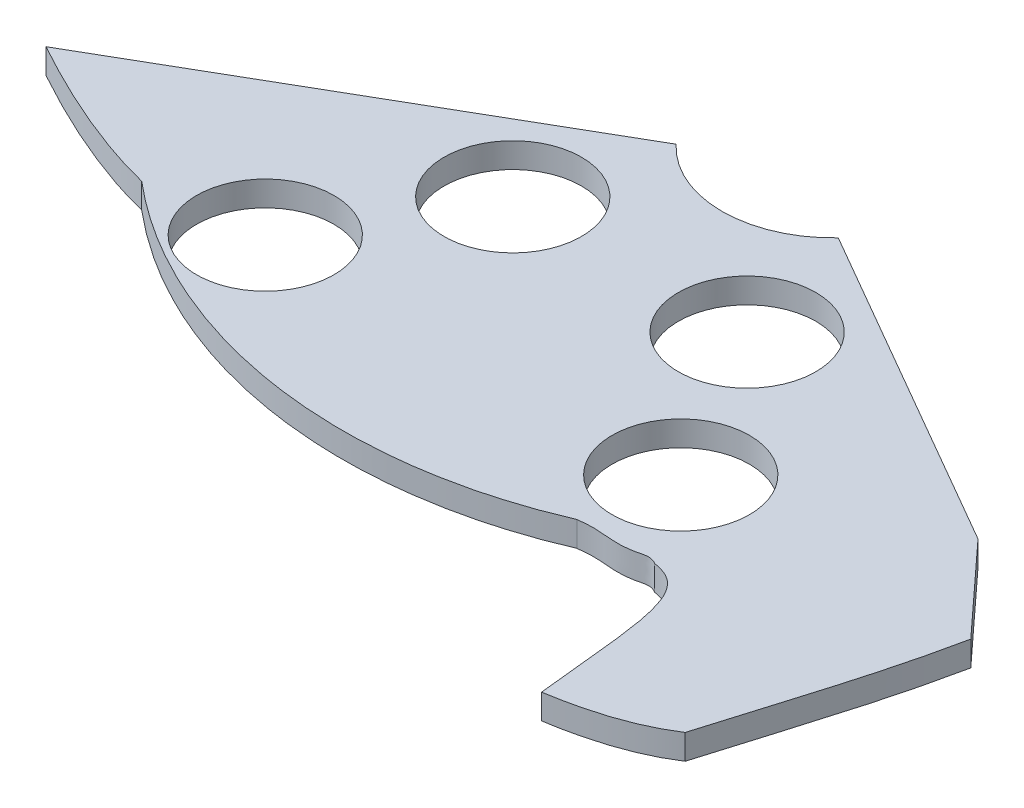
ISO-10303-21;
HEADER;
FILE_DESCRIPTION(('STEP AP214'),'2;1');
FILE_NAME('part.step','',(''),(''),'','','');
FILE_SCHEMA(('AUTOMOTIVE_DESIGN { 1 0 10303 214 1 1 1 1 }'));
ENDSEC;
DATA;
#1=APPLICATION_CONTEXT('core data for automotive mechanical design processes');
#2=APPLICATION_PROTOCOL_DEFINITION('international standard','automotive_design',2000,#1);
#3=PRODUCT_CONTEXT('',#1,'mechanical');
#4=PRODUCT('Part','Part','',(#3));
#5=PRODUCT_RELATED_PRODUCT_CATEGORY('part','',(#4));
#6=PRODUCT_DEFINITION_FORMATION('','',#4);
#7=PRODUCT_DEFINITION_CONTEXT('part definition',#1,'design');
#8=PRODUCT_DEFINITION('design','',#6,#7);
#9=PRODUCT_DEFINITION_SHAPE('','',#8);
#10=(LENGTH_UNIT() NAMED_UNIT(*) SI_UNIT(.MILLI.,.METRE.));
#11=(NAMED_UNIT(*) PLANE_ANGLE_UNIT() SI_UNIT($,.RADIAN.));
#12=(NAMED_UNIT(*) SI_UNIT($,.STERADIAN.) SOLID_ANGLE_UNIT());
#13=UNCERTAINTY_MEASURE_WITH_UNIT(LENGTH_MEASURE(1.E-05),#10,'distance_accuracy_value','');
#14=(GEOMETRIC_REPRESENTATION_CONTEXT(3) GLOBAL_UNCERTAINTY_ASSIGNED_CONTEXT((#13)) GLOBAL_UNIT_ASSIGNED_CONTEXT((#10,
#11,#12)) REPRESENTATION_CONTEXT('',''));
#15=CARTESIAN_POINT('',(0.,0.,0.));
#16=DIRECTION('',(0.,0.,1.));
#17=DIRECTION('',(1.,0.,0.));
#18=AXIS2_PLACEMENT_3D('',#15,#16,#17);
#19=CARTESIAN_POINT('',(-64.1008296728101,-39.7359999999999,55.3526339606867));
#20=DIRECTION('',(0.,1.,0.));
#21=DIRECTION('',(0.,0.,1.));
#22=AXIS2_PLACEMENT_3D('',#19,#20,#21);
#23=PLANE('',#22);
#24=CARTESIAN_POINT('',(18.75,-39.7359999999999,32.476));
#25=DIRECTION('',(0.,-1.,0.));
#26=DIRECTION('',(0.,0.,-1.));
#27=AXIS2_PLACEMENT_3D('',#24,#25,#26);
#28=CIRCLE('',#27,10.999845998306);
#29=CARTESIAN_POINT('',(18.75,-39.7359999999999,21.476154001694));
#30=VERTEX_POINT('',#29);
#31=EDGE_CURVE('E513',#30,#30,#28,.T.);
#32=ORIENTED_EDGE('',*,*,#31,.F.);
#33=EDGE_LOOP('',(#32));
#34=FACE_BOUND('',#33,.T.);
#35=CARTESIAN_POINT('',(-33.25,-39.7359999999999,57.591));
#36=DIRECTION('',(0.,-1.,0.));
#37=DIRECTION('',(0.,0.,-1.));
#38=AXIS2_PLACEMENT_3D('',#35,#36,#37);
#39=CIRCLE('',#38,10.999845998306);
#40=CARTESIAN_POINT('',(-33.25,-39.7359999999999,46.591154001694));
#41=VERTEX_POINT('',#40);
#42=EDGE_CURVE('E444',#41,#41,#39,.T.);
#43=ORIENTED_EDGE('',*,*,#42,.F.);
#44=EDGE_LOOP('',(#43));
#45=FACE_BOUND('',#44,.T.);
#46=DIRECTION('',(0.866024373768481,0.,-0.500001784035727));
#47=VECTOR('',#46,1.);
#48=CARTESIAN_POINT('',(-69.4473149774022,-39.7359999999999,44.7142826012584));
#49=LINE('',#48,#47);
#50=CARTESIAN_POINT('',(-76.9089394758876,-39.7359999999999,49.0222740089515));
#51=VERTEX_POINT('',#50);
#52=CARTESIAN_POINT('',(-69.4473149774022,-39.7359999999999,44.7142826012584));
#53=VERTEX_POINT('',#52);
#54=EDGE_CURVE('E414',#51,#53,#49,.T.);
#55=ORIENTED_EDGE('',*,*,#54,.T.);
#56=DIRECTION('',(0.866025119197463,0.,-0.500000492918778));
#57=VECTOR('',#56,1.);
#58=CARTESIAN_POINT('',(-69.4473149774022,-39.7359999999999,44.7142826012584));
#59=LINE('',#58,#57);
#60=CARTESIAN_POINT('',(-12.9766531358799,-39.7359999999999,12.1108879302399));
#61=VERTEX_POINT('',#60);
#62=EDGE_CURVE('E104',#53,#61,#59,.T.);
#63=ORIENTED_EDGE('',*,*,#62,.T.);
#64=CARTESIAN_POINT('',(0.,-39.7359999999999,0.));
#65=DIRECTION('',(0.,1.,0.));
#66=DIRECTION('',(0.,0.,-1.));
#67=AXIS2_PLACEMENT_3D('',#64,#65,#66);
#68=CIRCLE('',#67,17.7501305084715);
#69=CARTESIAN_POINT('',(12.9766531358511,-39.7359999999999,12.1108879302707));
#70=VERTEX_POINT('',#69);
#71=EDGE_CURVE('E363',#61,#70,#68,.T.);
#72=ORIENTED_EDGE('',*,*,#71,.T.);
#73=DIRECTION('',(0.866025113442762,0.,0.500000502886197));
#74=VECTOR('',#73,1.);
#75=CARTESIAN_POINT('',(12.9766531358511,-39.7359999999999,12.1108879302707));
#76=LINE('',#75,#74);
#77=CARTESIAN_POINT('',(65.8946490574716,-39.7359999999999,42.6631480920527));
#78=VERTEX_POINT('',#77);
#79=EDGE_CURVE('E286',#70,#78,#76,.T.);
#80=ORIENTED_EDGE('',*,*,#79,.T.);
#81=DIRECTION('',(0.677060326442857,0.,0.735927519771541));
#82=VECTOR('',#81,1.);
#83=CARTESIAN_POINT('',(79.1970292898882,-39.7359999999999,57.1221073740606));
#84=LINE('',#83,#82);
#85=CARTESIAN_POINT('',(79.1970292898882,-39.7359999999999,57.1221073740606));
#86=VERTEX_POINT('',#85);
#87=EDGE_CURVE('E361',#78,#86,#84,.T.);
#88=ORIENTED_EDGE('',*,*,#87,.T.);
#89=CARTESIAN_POINT('',(69.2855065903759,-39.7359999999999,92.9184580118978));
#90=CARTESIAN_POINT('',(69.4002538775291,-39.7359999999999,92.5222540101261));
#91=CARTESIAN_POINT('',(69.6300389590026,-39.7359999999999,91.7288429318694));
#92=CARTESIAN_POINT('',(70.1847648336312,-39.7359999999999,89.8447142366192));
#93=CARTESIAN_POINT('',(70.9572226874372,-39.7359999999999,87.2695817745134));
#94=CARTESIAN_POINT('',(72.9456119195531,-39.7359999999999,80.742135446839));
#95=CARTESIAN_POINT('',(75.2644677415504,-39.7359999999999,73.1283290469956));
#96=CARTESIAN_POINT('',(77.3099847680534,-39.7359999999999,65.4410399026022));
#97=CARTESIAN_POINT('',(78.3655445891447,-39.7359999999999,61.0202220563852));
#98=CARTESIAN_POINT('',(78.8920030356088,-39.7359999999999,58.6133896887778));
#99=CARTESIAN_POINT('',(79.1587610935595,-39.7359999999999,57.3092017097136));
#100=CARTESIAN_POINT('',(79.1970292898882,-39.7359999999999,57.1221073740606));
#101=B_SPLINE_CURVE_WITH_KNOTS('',3,(#89,#90,#91,#92,#93,#94,#95,#96,#97,#98,#99,#100),
.UNSPECIFIED.,.F.,.F.,(4,1,1,1,1,1,1,1,1,4),(0.,0.0333037845280377,0.0666918846711773,
0.158579199377878,0.250368635928648,0.617630447247149,0.801097325268403,0.892520636953014,
0.984581379104481,1.),.UNSPECIFIED.);
#102=CARTESIAN_POINT('',(69.2855065903759,-39.7359999999999,92.9184580118978));
#103=VERTEX_POINT('',#102);
#104=EDGE_CURVE('E351',#86,#103,#101,.F.);
#105=ORIENTED_EDGE('',*,*,#104,.T.);
#106=CARTESIAN_POINT('',(69.2855595308861,-39.7359999999999,92.9184233978742));
#107=CARTESIAN_POINT('',(64.6606264518804,-39.7359999999999,95.9423447605432));
#108=CARTESIAN_POINT('',(58.8846556478236,-39.7359999999999,97.753793539483));
#109=CARTESIAN_POINT('',(52.2056314825915,-39.7359999999999,98.8198480716692));
#110=B_SPLINE_CURVE_WITH_KNOTS('',3,(#106,#107,#108,#109),.UNSPECIFIED.,.F.,.F.,(4,4),(0.,1.),.UNSPECIFIED.);
#111=CARTESIAN_POINT('',(52.2056498983986,-39.7359999999999,98.8198451322773));
#112=VERTEX_POINT('',#111);
#113=EDGE_CURVE('E253',#103,#112,#110,.T.);
#114=ORIENTED_EDGE('',*,*,#113,.T.);
#115=CARTESIAN_POINT('',(43.415947867679,-39.7359999999999,71.9350034455184));
#116=CARTESIAN_POINT('',(43.4172874413225,-39.7359999999999,71.9352179505577));
#117=CARTESIAN_POINT('',(43.8102417543151,-39.7359999999999,71.9982079187092));
#118=CARTESIAN_POINT('',(44.5917055535922,-39.7359999999999,72.162576315903));
#119=CARTESIAN_POINT('',(45.7153781390991,-39.7359999999999,72.5750252871819));
#120=CARTESIAN_POINT('',(46.7409157718378,-39.7359999999999,73.2036174013261));
#121=CARTESIAN_POINT('',(47.6029392915592,-39.7359999999999,74.0401761539171));
#122=CARTESIAN_POINT('',(48.2881989731019,-39.7359999999999,75.0270341559532));
#123=CARTESIAN_POINT('',(48.8123045939889,-39.7359999999999,76.0796361046993));
#124=CARTESIAN_POINT('',(49.2374381758095,-39.7359999999999,77.2002091123776));
#125=CARTESIAN_POINT('',(49.6940686277384,-39.7359999999999,78.7281622418727));
#126=CARTESIAN_POINT('',(50.1224227993347,-39.7359999999999,80.6971271222097));
#127=CARTESIAN_POINT('',(50.5051842168028,-39.7359999999999,83.0541653993403));
#128=CARTESIAN_POINT('',(50.8140790496967,-39.7359999999999,85.4228115978649));
#129=CARTESIAN_POINT('',(51.0802058683154,-39.7359999999999,87.7976318126318));
#130=CARTESIAN_POINT('',(51.3233230419941,-39.7359999999999,90.1751181146994));
#131=CARTESIAN_POINT('',(51.5575045440305,-39.7359999999999,92.5534697700242));
#132=CARTESIAN_POINT('',(51.7939800257398,-39.7359999999999,94.9315937444865));
#133=CARTESIAN_POINT('',(52.0086926708751,-39.7359999999999,97.0205495349264));
#134=CARTESIAN_POINT('',(52.1505123114549,-39.7359999999999,98.3161377096889));
#135=CARTESIAN_POINT('',(52.2056498983984,-39.7359999999999,98.8198451322774));
#136=B_SPLINE_CURVE_WITH_KNOTS('',3,(#115,#116,#117,#118,#119,#120,#121,#122,#123,#124,#125,
#126,#127,#128,#129,#130,#131,#132,#133,#134,#135),.UNSPECIFIED.,.F.,.F.,(4,1,1,1,1,1,1,1,1,1,1,
1,1,1,1,1,1,1,4),(0.,0.000123868567167063,0.0363368285341082,0.0727770957602,0.108914458509193,
0.14535808353502,0.181661815384777,0.218139219801277,0.25250130988303,0.291023549525604,
0.363704477467445,0.436358444100682,0.509101927983722,0.581867497498187,0.654630974803272,
0.727395657439822,0.800160096597664,0.87292352557966,0.919207614655686),.UNSPECIFIED.);
#137=CARTESIAN_POINT('',(43.415947867679,-39.7359999999999,71.9350034455184));
#138=VERTEX_POINT('',#137);
#139=EDGE_CURVE('E134',#112,#138,#136,.F.);
#140=ORIENTED_EDGE('',*,*,#139,.T.);
#141=CARTESIAN_POINT('',(31.1039911570122,-39.7359999999999,72.0756458441432));
#142=CARTESIAN_POINT('',(31.1998559852337,-39.7359999999999,72.0615008057664));
#143=CARTESIAN_POINT('',(31.3792174796028,-39.7359999999999,72.0350356749332));
#144=CARTESIAN_POINT('',(31.7627175661865,-39.7359999999999,71.9856158408891));
#145=CARTESIAN_POINT('',(32.4587838164455,-39.7359999999999,71.9140191259539));
#146=CARTESIAN_POINT('',(33.4851732014523,-39.7359999999999,71.8699314544222));
#147=CARTESIAN_POINT('',(34.5120384368433,-39.7359999999999,71.9087017109127));
#148=CARTESIAN_POINT('',(35.3328357653474,-39.7359999999999,71.9703695458975));
#149=CARTESIAN_POINT('',(36.1543112388427,-39.7359999999999,72.0401733727866));
#150=CARTESIAN_POINT('',(37.1824902877891,-39.7359999999999,72.1165611899179));
#151=CARTESIAN_POINT('',(38.4190312132884,-39.7359999999999,72.1128578744163));
#152=CARTESIAN_POINT('',(39.4427175333033,-39.7359999999999,72.0004928601377));
#153=CARTESIAN_POINT('',(40.1310283920042,-39.7359999999999,71.8704102402189));
#154=CARTESIAN_POINT('',(41.3266559089269,-39.7359999999999,71.6027179576982));
#155=CARTESIAN_POINT('',(42.2891950627703,-39.7359999999999,71.2426780535642));
#156=CARTESIAN_POINT('',(43.4159478676715,-39.7359999999999,71.9350034455306));
#157=B_SPLINE_CURVE_WITH_KNOTS('',3,(#141,#142,#143,#144,#145,#146,#147,#148,#149,#150,#151,
#152,#153,#154,#155,#156),.UNSPECIFIED.,.F.,.F.,(4,1,1,1,1,1,1,1,1,1,1,1,1,4),
(-0.642193311149735,-0.612277758475907,-0.586221811153292,-0.522824702597624,-0.396293501540959,
-0.269455158376573,-0.205827956479538,-0.142180858042697,-0.0149229380841818,0.112362246285873,
0.238983737580651,0.302347747672666,0.328550683258338,0.617207737244339),.UNSPECIFIED.);
#158=CARTESIAN_POINT('',(31.1039911570109,-39.7359999999999,72.0756458441434));
#159=VERTEX_POINT('',#158);
#160=EDGE_CURVE('E126',#138,#159,#157,.F.);
#161=ORIENTED_EDGE('',*,*,#160,.T.);
#162=CARTESIAN_POINT('',(-50.6055018087058,-39.7359999999999,60.0113610982558));
#163=CARTESIAN_POINT('',(-47.835559784012,-39.7359999999999,62.3474531216316));
#164=CARTESIAN_POINT('',(-44.902666570116,-39.7359999999999,64.4912186014283));
#165=CARTESIAN_POINT('',(-38.7695030831463,-39.7359999999999,68.3545128673294));
#166=CARTESIAN_POINT('',(-35.5703266994339,-39.7359999999999,70.0724951524923));
#167=CARTESIAN_POINT('',(-28.9614031044789,-39.7359999999999,73.0516847439028));
#168=CARTESIAN_POINT('',(-25.5553239311859,-39.7359999999999,74.3127383410476));
#169=CARTESIAN_POINT('',(-18.5999673392454,-39.7359999999999,76.3504086902767));
#170=CARTESIAN_POINT('',(-15.0507609648869,-39.7359999999999,77.1284511722336));
#171=CARTESIAN_POINT('',(-7.88082467823839,-39.7359999999999,78.1871715246578));
#172=CARTESIAN_POINT('',(-4.25899207207086,-39.7359999999999,78.4672878776893));
#173=CARTESIAN_POINT('',(2.98951940338237,-39.7359999999999,78.5262742826789));
#174=CARTESIAN_POINT('',(6.61442943794312,-39.7359999999999,78.3047875851458));
#175=CARTESIAN_POINT('',(13.8011213220885,-39.7359999999999,77.3617402184114));
#176=CARTESIAN_POINT('',(17.3618842016208,-39.7359999999999,76.6417221137031));
#177=CARTESIAN_POINT('',(24.3495535647918,-39.7359999999999,74.7161552678264));
#178=CARTESIAN_POINT('',(27.7772725927033,-39.7359999999999,73.5112547084871));
#179=CARTESIAN_POINT('',(31.1039911569857,-39.7359999999999,72.0756458440924));
#180=B_SPLINE_CURVE_WITH_KNOTS('',3,(#162,#163,#164,#165,#166,#167,#168,#169,#170,#171,#172,
#173,#174,#175,#176,#177,#178,#179),.UNSPECIFIED.,.F.,.F.,(4,2,2,2,2,2,2,2,4),
(1.94434611078265E-06,0.125001944346111,0.250001944346111,0.375001944346111,0.500001944346111,
0.625001944346111,0.750001944346111,0.875001944346111,1.),.UNSPECIFIED.);
#181=CARTESIAN_POINT('',(-50.605498273497,-39.7359999999999,60.0113640797524));
#182=VERTEX_POINT('',#181);
#183=EDGE_CURVE('E131',#159,#182,#180,.F.);
#184=ORIENTED_EDGE('',*,*,#183,.T.);
#185=CARTESIAN_POINT('',(-76.9089394758876,-39.7359999999999,49.0222740089515));
#186=CARTESIAN_POINT('',(-76.646044074988,-39.7359999999999,49.1675217340741));
#187=CARTESIAN_POINT('',(-75.679135238116,-39.7359999999999,49.7017315699096));
#188=CARTESIAN_POINT('',(-73.9377249126982,-39.7359999999999,50.6378966457041));
#189=CARTESIAN_POINT('',(-70.9618297632087,-39.7359999999999,52.1787462416276));
#190=CARTESIAN_POINT('',(-67.6522686903208,-39.7359999999999,53.7833949855582));
#191=CARTESIAN_POINT('',(-64.0716237538903,-39.7359999999999,55.3828520640737));
#192=CARTESIAN_POINT('',(-60.9727150408043,-39.7359999999999,56.6610451947223));
#193=CARTESIAN_POINT('',(-58.1055146958569,-39.7359999999999,57.7390602851884));
#194=CARTESIAN_POINT('',(-55.4652443634137,-39.7359999999999,58.639267280139));
#195=CARTESIAN_POINT('',(-53.511167676541,-39.7359999999999,59.2429187233151));
#196=CARTESIAN_POINT('',(-52.0027499269396,-39.7359999999999,59.6615580941354));
#197=CARTESIAN_POINT('',(-51.187819577167,-39.7359999999999,59.8695212188716));
#198=CARTESIAN_POINT('',(-50.7208379389687,-39.7359999999999,59.9832694385394));
#199=CARTESIAN_POINT('',(-50.6054982735364,-39.7359999999999,60.011364079799));
#200=B_SPLINE_CURVE_WITH_KNOTS('',3,(#185,#186,#187,#188,#189,#190,#191,#192,#193,#194,#195,
#196,#197,#198,#199),.UNSPECIFIED.,.F.,.F.,(4,1,1,1,1,1,1,1,1,1,1,1,4),(0.,0.0315216092185369,
0.115934026999068,0.207484601481928,0.383210175454919,0.501847431627288,0.619012557784055,
0.734964204535287,0.823259876068906,0.911739042278875,0.949557586966137,0.987541242380807,1.),.UNSPECIFIED.);
#201=EDGE_CURVE('E49',#182,#51,#200,.F.);
#202=ORIENTED_EDGE('',*,*,#201,.T.);
#203=EDGE_LOOP('',(#55,#63,#72,#80,#88,#105,#114,#140,#161,#184,#202));
#204=FACE_BOUND('',#203,.T.);
#205=CARTESIAN_POINT('',(33.25,-39.7359999999999,57.591));
#206=DIRECTION('',(0.,-1.,0.));
#207=DIRECTION('',(0.,0.,-1.));
#208=AXIS2_PLACEMENT_3D('',#205,#206,#207);
#209=CIRCLE('',#208,10.999845998306);
#210=CARTESIAN_POINT('',(33.25,-39.7359999999999,46.591154001694));
#211=VERTEX_POINT('',#210);
#212=EDGE_CURVE('E453',#211,#211,#209,.T.);
#213=ORIENTED_EDGE('',*,*,#212,.F.);
#214=EDGE_LOOP('',(#213));
#215=FACE_BOUND('',#214,.T.);
#216=CARTESIAN_POINT('',(-18.75,-39.7359999999999,32.476));
#217=DIRECTION('',(0.,-1.,0.));
#218=DIRECTION('',(0.,0.,-1.));
#219=AXIS2_PLACEMENT_3D('',#216,#217,#218);
#220=CIRCLE('',#219,10.999845998306);
#221=CARTESIAN_POINT('',(-18.75,-39.7359999999999,21.476154001694));
#222=VERTEX_POINT('',#221);
#223=EDGE_CURVE('E514',#222,#222,#220,.T.);
#224=ORIENTED_EDGE('',*,*,#223,.F.);
#225=EDGE_LOOP('',(#224));
#226=FACE_BOUND('',#225,.T.);
#227=ADVANCED_FACE('F30',(#34,#45,#204,#215,#226),#23,.F.);
#228=CARTESIAN_POINT('',(-64.1008296728101,-35.7359999999999,55.3526339606867));
#229=DIRECTION('',(0.,1.,0.));
#230=DIRECTION('',(0.,0.,1.));
#231=AXIS2_PLACEMENT_3D('',#228,#229,#230);
#232=PLANE('',#231);
#233=CARTESIAN_POINT('',(18.75,-35.7359999999999,32.476));
#234=DIRECTION('',(0.,-1.,0.));
#235=DIRECTION('',(0.,0.,-1.));
#236=AXIS2_PLACEMENT_3D('',#233,#234,#235);
#237=CIRCLE('',#236,10.999845998306);
#238=CARTESIAN_POINT('',(18.75,-35.7359999999999,21.476154001694));
#239=VERTEX_POINT('',#238);
#240=EDGE_CURVE('E511',#239,#239,#237,.T.);
#241=ORIENTED_EDGE('',*,*,#240,.T.);
#242=EDGE_LOOP('',(#241));
#243=FACE_BOUND('',#242,.T.);
#244=CARTESIAN_POINT('',(-33.25,-35.7359999999999,57.591));
#245=DIRECTION('',(0.,-1.,0.));
#246=DIRECTION('',(0.,0.,-1.));
#247=AXIS2_PLACEMENT_3D('',#244,#245,#246);
#248=CIRCLE('',#247,10.999845998306);
#249=CARTESIAN_POINT('',(-33.25,-35.7359999999999,46.591154001694));
#250=VERTEX_POINT('',#249);
#251=EDGE_CURVE('E448',#250,#250,#248,.T.);
#252=ORIENTED_EDGE('',*,*,#251,.T.);
#253=EDGE_LOOP('',(#252));
#254=FACE_BOUND('',#253,.T.);
#255=DIRECTION('',(0.866024373768481,0.,-0.500001784035727));
#256=VECTOR('',#255,1.);
#257=CARTESIAN_POINT('',(-69.4473149774022,-35.7359999999999,44.7142826012584));
#258=LINE('',#257,#256);
#259=CARTESIAN_POINT('',(-76.9089394758876,-35.7359999999999,49.0222740089515));
#260=VERTEX_POINT('',#259);
#261=CARTESIAN_POINT('',(-69.4473149774022,-35.7359999999999,44.7142826012584));
#262=VERTEX_POINT('',#261);
#263=EDGE_CURVE('E199',#260,#262,#258,.T.);
#264=ORIENTED_EDGE('',*,*,#263,.F.);
#265=CARTESIAN_POINT('',(-50.6054982735364,-35.7359999999999,60.011364079799));
#266=CARTESIAN_POINT('',(-50.7208379389687,-35.7359999999999,59.9832694385394));
#267=CARTESIAN_POINT('',(-51.187819577167,-35.7359999999999,59.8695212188716));
#268=CARTESIAN_POINT('',(-52.0027499269396,-35.7359999999999,59.6615580941354));
#269=CARTESIAN_POINT('',(-53.511167676541,-35.7359999999999,59.2429187233151));
#270=CARTESIAN_POINT('',(-55.4652443634137,-35.7359999999999,58.639267280139));
#271=CARTESIAN_POINT('',(-58.1055146958569,-35.7359999999999,57.7390602851884));
#272=CARTESIAN_POINT('',(-60.9727150408043,-35.7359999999999,56.6610451947223));
#273=CARTESIAN_POINT('',(-64.0716237538903,-35.7359999999999,55.3828520640737));
#274=CARTESIAN_POINT('',(-67.6522686903208,-35.7359999999999,53.7833949855582));
#275=CARTESIAN_POINT('',(-70.9618297632087,-35.7359999999999,52.1787462416276));
#276=CARTESIAN_POINT('',(-73.9377249126982,-35.7359999999999,50.6378966457041));
#277=CARTESIAN_POINT('',(-75.679135238116,-35.7359999999999,49.7017315699096));
#278=CARTESIAN_POINT('',(-76.646044074988,-35.7359999999999,49.1675217340741));
#279=CARTESIAN_POINT('',(-76.9089394758876,-35.7359999999999,49.0222740089515));
#280=B_SPLINE_CURVE_WITH_KNOTS('',3,(#265,#266,#267,#268,#269,#270,#271,#272,#273,#274,#275,
#276,#277,#278,#279),.UNSPECIFIED.,.F.,.F.,(4,1,1,1,1,1,1,1,1,1,1,1,4),(0.,0.0124587576191928,
0.0504424130338629,0.0882609577211254,0.176740123931094,0.265035795464713,0.380987442215945,
0.498152568372712,0.616789824545081,0.792515398518072,0.884065973000932,0.968478390781463,1.),.UNSPECIFIED.);
#281=CARTESIAN_POINT('',(-50.605498273497,-35.7359999999999,60.0113640797524));
#282=VERTEX_POINT('',#281);
#283=EDGE_CURVE('E95',#282,#260,#280,.T.);
#284=ORIENTED_EDGE('',*,*,#283,.F.);
#285=CARTESIAN_POINT('',(31.1039911569857,-35.7359999999999,72.0756458440924));
#286=CARTESIAN_POINT('',(27.7772725927033,-35.7359999999999,73.5112547084871));
#287=CARTESIAN_POINT('',(24.3495535647918,-35.7359999999999,74.7161552678264));
#288=CARTESIAN_POINT('',(17.3618842016208,-35.7359999999999,76.6417221137031));
#289=CARTESIAN_POINT('',(13.8011213220885,-35.7359999999999,77.3617402184114));
#290=CARTESIAN_POINT('',(6.61442943794312,-35.7359999999999,78.3047875851458));
#291=CARTESIAN_POINT('',(2.98951940338237,-35.7359999999999,78.5262742826789));
#292=CARTESIAN_POINT('',(-4.25899207207086,-35.7359999999999,78.4672878776893));
#293=CARTESIAN_POINT('',(-7.88082467823839,-35.7359999999999,78.1871715246578));
#294=CARTESIAN_POINT('',(-15.0507609648869,-35.7359999999999,77.1284511722336));
#295=CARTESIAN_POINT('',(-18.5999673392454,-35.7359999999999,76.3504086902767));
#296=CARTESIAN_POINT('',(-25.5553239311859,-35.7359999999999,74.3127383410476));
#297=CARTESIAN_POINT('',(-28.9614031044789,-35.7359999999999,73.0516847439028));
#298=CARTESIAN_POINT('',(-35.5703266994339,-35.7359999999999,70.0724951524923));
#299=CARTESIAN_POINT('',(-38.7695030831463,-35.7359999999999,68.3545128673294));
#300=CARTESIAN_POINT('',(-44.902666570116,-35.7359999999999,64.4912186014283));
#301=CARTESIAN_POINT('',(-47.835559784012,-35.7359999999999,62.3474531216316));
#302=CARTESIAN_POINT('',(-50.6055018087058,-35.7359999999999,60.0113610982558));
#303=B_SPLINE_CURVE_WITH_KNOTS('',3,(#285,#286,#287,#288,#289,#290,#291,#292,#293,#294,#295,
#296,#297,#298,#299,#300,#301,#302),.UNSPECIFIED.,.F.,.F.,(4,2,2,2,2,2,2,2,4),
(1.94434611080987E-06,0.125,0.25,0.375,0.5,0.625,0.75,0.875,1.),.UNSPECIFIED.);
#304=CARTESIAN_POINT('',(31.1039911570109,-35.7359999999999,72.0756458441434));
#305=VERTEX_POINT('',#304);
#306=EDGE_CURVE('E88',#305,#282,#303,.T.);
#307=ORIENTED_EDGE('',*,*,#306,.F.);
#308=CARTESIAN_POINT('',(43.4159478676715,-35.7359999999999,71.9350034455306));
#309=CARTESIAN_POINT('',(42.2891950627703,-35.7359999999999,71.2426780535642));
#310=CARTESIAN_POINT('',(41.3266559089269,-35.7359999999999,71.6027179576982));
#311=CARTESIAN_POINT('',(40.1310283920042,-35.7359999999999,71.8704102402189));
#312=CARTESIAN_POINT('',(39.4427175333033,-35.7359999999999,72.0004928601377));
#313=CARTESIAN_POINT('',(38.4190312132884,-35.7359999999999,72.1128578744163));
#314=CARTESIAN_POINT('',(37.1824902877891,-35.7359999999999,72.1165611899179));
#315=CARTESIAN_POINT('',(36.1543112388427,-35.7359999999999,72.0401733727866));
#316=CARTESIAN_POINT('',(35.3328357653474,-35.7359999999999,71.9703695458975));
#317=CARTESIAN_POINT('',(34.5120384368433,-35.7359999999999,71.9087017109127));
#318=CARTESIAN_POINT('',(33.4851732014523,-35.7359999999999,71.8699314544222));
#319=CARTESIAN_POINT('',(32.4587838164455,-35.7359999999999,71.9140191259539));
#320=CARTESIAN_POINT('',(31.7627175661865,-35.7359999999999,71.9856158408891));
#321=CARTESIAN_POINT('',(31.3792174796028,-35.7359999999999,72.0350356749332));
#322=CARTESIAN_POINT('',(31.1998559852337,-35.7359999999999,72.0615008057664));
#323=CARTESIAN_POINT('',(31.1039911570122,-35.7359999999999,72.0756458441432));
#324=B_SPLINE_CURVE_WITH_KNOTS('',3,(#308,#309,#310,#311,#312,#313,#314,#315,#316,#317,#318,
#319,#320,#321,#322,#323),.UNSPECIFIED.,.F.,.F.,(4,1,1,1,1,1,1,1,1,1,1,1,1,4),
(-0.642193311149735,-0.353536257163734,-0.327333321578063,-0.263969311486048,-0.137347820191269,
-0.0100626358212148,0.117195284137301,0.180842382574141,0.244469584471177,0.371307927635562,
0.497839128692227,0.561236237247895,0.587292184570511,0.617207737244339),.UNSPECIFIED.);
#325=CARTESIAN_POINT('',(43.415947867679,-35.7359999999999,71.9350034455184));
#326=VERTEX_POINT('',#325);
#327=EDGE_CURVE('E145',#326,#305,#324,.T.);
#328=ORIENTED_EDGE('',*,*,#327,.F.);
#329=CARTESIAN_POINT('',(52.2056498983984,-35.7359999999999,98.8198451322774));
#330=CARTESIAN_POINT('',(52.1505123114549,-35.7359999999999,98.3161377096889));
#331=CARTESIAN_POINT('',(52.0086926708751,-35.7359999999999,97.0205495349264));
#332=CARTESIAN_POINT('',(51.7939800257398,-35.7359999999999,94.9315937444865));
#333=CARTESIAN_POINT('',(51.5575045440305,-35.7359999999999,92.5534697700242));
#334=CARTESIAN_POINT('',(51.3233230419941,-35.7359999999999,90.1751181146994));
#335=CARTESIAN_POINT('',(51.0802058683154,-35.7359999999999,87.7976318126318));
#336=CARTESIAN_POINT('',(50.8140790496967,-35.7359999999999,85.4228115978649));
#337=CARTESIAN_POINT('',(50.5051842168028,-35.7359999999999,83.0541653993403));
#338=CARTESIAN_POINT('',(50.1224227993347,-35.7359999999999,80.6971271222097));
#339=CARTESIAN_POINT('',(49.6940686277384,-35.7359999999999,78.7281622418727));
#340=CARTESIAN_POINT('',(49.2374381758095,-35.7359999999999,77.2002091123776));
#341=CARTESIAN_POINT('',(48.8123045939889,-35.7359999999999,76.0796361046993));
#342=CARTESIAN_POINT('',(48.2881989731019,-35.7359999999999,75.0270341559532));
#343=CARTESIAN_POINT('',(47.6029392915592,-35.7359999999999,74.0401761539171));
#344=CARTESIAN_POINT('',(46.7409157718378,-35.7359999999999,73.2036174013261));
#345=CARTESIAN_POINT('',(45.7153781390991,-35.7359999999999,72.5750252871819));
#346=CARTESIAN_POINT('',(44.5917055535922,-35.7359999999999,72.162576315903));
#347=CARTESIAN_POINT('',(43.8102417543151,-35.7359999999999,71.9982079187092));
#348=CARTESIAN_POINT('',(43.4172874413225,-35.7359999999999,71.9352179505577));
#349=CARTESIAN_POINT('',(43.415947867679,-35.7359999999999,71.9350034455184));
#350=B_SPLINE_CURVE_WITH_KNOTS('',3,(#329,#330,#331,#332,#333,#334,#335,#336,#337,#338,#339,
#340,#341,#342,#343,#344,#345,#346,#347,#348,#349),.UNSPECIFIED.,.F.,.F.,(4,1,1,1,1,1,1,1,1,1,1,
1,1,1,1,1,1,1,4),(0.,0.0462840890760257,0.119047518058022,0.191811957215864,0.264576639852414,
0.337340117157499,0.410105686671964,0.482849170555004,0.555503137188241,0.628184065130082,
0.666706304772656,0.701068394854409,0.737545799270909,0.773849531120666,0.810293156146493,
0.846430518895486,0.882870786121578,0.919083746088519,0.919207614655686),.UNSPECIFIED.);
#351=CARTESIAN_POINT('',(52.2056498983986,-35.7359999999999,98.8198451322773));
#352=VERTEX_POINT('',#351);
#353=EDGE_CURVE('E334',#352,#326,#350,.T.);
#354=ORIENTED_EDGE('',*,*,#353,.F.);
#355=CARTESIAN_POINT('',(69.2855595308861,-35.7359999999999,92.9184233978742));
#356=CARTESIAN_POINT('',(64.6606264518804,-35.7359999999999,95.9423447605432));
#357=CARTESIAN_POINT('',(58.8846556478236,-35.7359999999999,97.753793539483));
#358=CARTESIAN_POINT('',(52.2056314825915,-35.7359999999999,98.8198480716692));
#359=B_SPLINE_CURVE_WITH_KNOTS('',3,(#355,#356,#357,#358),.UNSPECIFIED.,.F.,.F.,(4,4),(0.,1.),.UNSPECIFIED.);
#360=CARTESIAN_POINT('',(69.2855065903759,-35.7359999999999,92.9184580118978));
#361=VERTEX_POINT('',#360);
#362=EDGE_CURVE('E331',#361,#352,#359,.T.);
#363=ORIENTED_EDGE('',*,*,#362,.F.);
#364=CARTESIAN_POINT('',(79.1970292898882,-35.7359999999999,57.1221073740606));
#365=CARTESIAN_POINT('',(79.1587610935595,-35.7359999999999,57.3092017097136));
#366=CARTESIAN_POINT('',(78.8920030356088,-35.7359999999999,58.6133896887778));
#367=CARTESIAN_POINT('',(78.3655445891447,-35.7359999999999,61.0202220563852));
#368=CARTESIAN_POINT('',(77.3099847680534,-35.7359999999999,65.4410399026022));
#369=CARTESIAN_POINT('',(75.2644677415504,-35.7359999999999,73.1283290469956));
#370=CARTESIAN_POINT('',(72.9456119195531,-35.7359999999999,80.742135446839));
#371=CARTESIAN_POINT('',(70.9572226874372,-35.7359999999999,87.2695817745134));
#372=CARTESIAN_POINT('',(70.1847648336312,-35.7359999999999,89.8447142366192));
#373=CARTESIAN_POINT('',(69.6300389590026,-35.7359999999999,91.7288429318694));
#374=CARTESIAN_POINT('',(69.4002538775291,-35.7359999999999,92.5222540101261));
#375=CARTESIAN_POINT('',(69.2855065903759,-35.7359999999999,92.9184580118978));
#376=B_SPLINE_CURVE_WITH_KNOTS('',3,(#364,#365,#366,#367,#368,#369,#370,#371,#372,#373,#374,
#375),.UNSPECIFIED.,.F.,.F.,(4,1,1,1,1,1,1,1,1,4),(0.,0.0154186208955191,0.107479363046986,
0.198902674731597,0.382369552752851,0.749631364071352,0.841420800622122,0.933308115328823,
0.966696215471962,1.),.UNSPECIFIED.);
#377=CARTESIAN_POINT('',(79.1970292898882,-35.7359999999999,57.1221073740606));
#378=VERTEX_POINT('',#377);
#379=EDGE_CURVE('E320',#378,#361,#376,.T.);
#380=ORIENTED_EDGE('',*,*,#379,.F.);
#381=DIRECTION('',(0.677060326442857,0.,0.735927519771541));
#382=VECTOR('',#381,1.);
#383=CARTESIAN_POINT('',(79.1970292898882,-35.7359999999999,57.1221073740606));
#384=LINE('',#383,#382);
#385=CARTESIAN_POINT('',(65.8946490574716,-35.7359999999999,42.6631480920527));
#386=VERTEX_POINT('',#385);
#387=EDGE_CURVE('E203',#386,#378,#384,.T.);
#388=ORIENTED_EDGE('',*,*,#387,.F.);
#389=DIRECTION('',(0.866025113442762,0.,0.500000502886197));
#390=VECTOR('',#389,1.);
#391=CARTESIAN_POINT('',(12.9766531358511,-35.7359999999999,12.1108879302707));
#392=LINE('',#391,#390);
#393=CARTESIAN_POINT('',(12.9766531358511,-35.7359999999999,12.1108879302707));
#394=VERTEX_POINT('',#393);
#395=EDGE_CURVE('E201',#394,#386,#392,.T.);
#396=ORIENTED_EDGE('',*,*,#395,.F.);
#397=CARTESIAN_POINT('',(0.,-35.7359999999999,0.));
#398=DIRECTION('',(0.,1.,0.));
#399=DIRECTION('',(0.,0.,-1.));
#400=AXIS2_PLACEMENT_3D('',#397,#398,#399);
#401=CIRCLE('',#400,17.7501305084715);
#402=CARTESIAN_POINT('',(-12.9766531358799,-35.7359999999999,12.1108879302399));
#403=VERTEX_POINT('',#402);
#404=EDGE_CURVE('E198',#403,#394,#401,.T.);
#405=ORIENTED_EDGE('',*,*,#404,.F.);
#406=DIRECTION('',(0.866025119197463,0.,-0.500000492918778));
#407=VECTOR('',#406,1.);
#408=CARTESIAN_POINT('',(-69.4473149774022,-35.7359999999999,44.7142826012584));
#409=LINE('',#408,#407);
#410=EDGE_CURVE('E193',#262,#403,#409,.T.);
#411=ORIENTED_EDGE('',*,*,#410,.F.);
#412=EDGE_LOOP('',(#264,#284,#307,#328,#354,#363,#380,#388,#396,#405,#411));
#413=FACE_BOUND('',#412,.T.);
#414=CARTESIAN_POINT('',(33.25,-35.7359999999999,57.591));
#415=DIRECTION('',(0.,-1.,0.));
#416=DIRECTION('',(0.,0.,-1.));
#417=AXIS2_PLACEMENT_3D('',#414,#415,#416);
#418=CIRCLE('',#417,10.999845998306);
#419=CARTESIAN_POINT('',(33.25,-35.7359999999999,46.591154001694));
#420=VERTEX_POINT('',#419);
#421=EDGE_CURVE('E456',#420,#420,#418,.T.);
#422=ORIENTED_EDGE('',*,*,#421,.T.);
#423=EDGE_LOOP('',(#422));
#424=FACE_BOUND('',#423,.T.);
#425=CARTESIAN_POINT('',(-18.75,-35.7359999999999,32.476));
#426=DIRECTION('',(0.,-1.,0.));
#427=DIRECTION('',(0.,0.,-1.));
#428=AXIS2_PLACEMENT_3D('',#425,#426,#427);
#429=CIRCLE('',#428,10.999845998306);
#430=CARTESIAN_POINT('',(-18.75,-35.7359999999999,21.476154001694));
#431=VERTEX_POINT('',#430);
#432=EDGE_CURVE('E519',#431,#431,#429,.T.);
#433=ORIENTED_EDGE('',*,*,#432,.T.);
#434=EDGE_LOOP('',(#433));
#435=FACE_BOUND('',#434,.T.);
#436=ADVANCED_FACE('F225',(#243,#254,#413,#424,#435),#232,.T.);
#437=CARTESIAN_POINT('',(-69.4473149774022,-39.7359999999999,44.7142826012584));
#438=DIRECTION('',(0.500001784035727,0.,0.866024373768481));
#439=DIRECTION('',(0.866024373768481,0.,-0.500001784035727));
#440=AXIS2_PLACEMENT_3D('',#437,#438,#439);
#441=PLANE('',#440);
#442=ORIENTED_EDGE('',*,*,#263,.T.);
#443=DIRECTION('',(0.,1.,0.));
#444=VECTOR('',#443,1.);
#445=CARTESIAN_POINT('',(-69.4473149774022,-39.7359999999999,44.7142826012584));
#446=LINE('',#445,#444);
#447=EDGE_CURVE('E11',#53,#262,#446,.T.);
#448=ORIENTED_EDGE('',*,*,#447,.F.);
#449=ORIENTED_EDGE('',*,*,#54,.F.);
#450=DIRECTION('',(0.,1.,0.));
#451=VECTOR('',#450,1.);
#452=CARTESIAN_POINT('',(-76.9089394758876,-39.7359999999999,49.0222740089515));
#453=LINE('',#452,#451);
#454=EDGE_CURVE('E481',#51,#260,#453,.T.);
#455=ORIENTED_EDGE('',*,*,#454,.T.);
#456=EDGE_LOOP('',(#442,#448,#449,#455));
#457=FACE_BOUND('',#456,.T.);
#458=ADVANCED_FACE('F32',(#457),#441,.F.);
#459=CARTESIAN_POINT('',(-69.4473149774022,-39.7359999999999,44.7142826012584));
#460=DIRECTION('',(0.500000492918778,0.,0.866025119197463));
#461=DIRECTION('',(0.866025119197463,0.,-0.500000492918778));
#462=AXIS2_PLACEMENT_3D('',#459,#460,#461);
#463=PLANE('',#462);
#464=ORIENTED_EDGE('',*,*,#410,.T.);
#465=DIRECTION('',(0.,1.,0.));
#466=VECTOR('',#465,1.);
#467=CARTESIAN_POINT('',(-12.9766531358799,-39.7359999999999,12.1108879302399));
#468=LINE('',#467,#466);
#469=EDGE_CURVE('E40',#61,#403,#468,.T.);
#470=ORIENTED_EDGE('',*,*,#469,.F.);
#471=ORIENTED_EDGE('',*,*,#62,.F.);
#472=ORIENTED_EDGE('',*,*,#447,.T.);
#473=EDGE_LOOP('',(#464,#470,#471,#472));
#474=FACE_BOUND('',#473,.T.);
#475=ADVANCED_FACE('F475',(#474),#463,.F.);
#476=CARTESIAN_POINT('',(0.,-39.7359999999999,0.));
#477=DIRECTION('',(0.,1.,0.));
#478=DIRECTION('',(0.,0.,1.));
#479=AXIS2_PLACEMENT_3D('',#476,#477,#478);
#480=CYLINDRICAL_SURFACE('',#479,17.7501305084715);
#481=ORIENTED_EDGE('',*,*,#404,.T.);
#482=DIRECTION('',(0.,1.,0.));
#483=VECTOR('',#482,1.);
#484=CARTESIAN_POINT('',(12.9766531358511,-39.7359999999999,12.1108879302707));
#485=LINE('',#484,#483);
#486=EDGE_CURVE('E207',#70,#394,#485,.T.);
#487=ORIENTED_EDGE('',*,*,#486,.F.);
#488=ORIENTED_EDGE('',*,*,#71,.F.);
#489=ORIENTED_EDGE('',*,*,#469,.T.);
#490=EDGE_LOOP('',(#481,#487,#488,#489));
#491=FACE_BOUND('',#490,.T.);
#492=ADVANCED_FACE('F463',(#491),#480,.F.);
#493=CARTESIAN_POINT('',(12.9766531358511,-39.7359999999999,12.1108879302707));
#494=DIRECTION('',(-0.500000502886198,0.,0.866025113442763));
#495=DIRECTION('',(0.866025113442763,0.,0.500000502886198));
#496=AXIS2_PLACEMENT_3D('',#493,#494,#495);
#497=PLANE('',#496);
#498=ORIENTED_EDGE('',*,*,#395,.T.);
#499=DIRECTION('',(0.,1.,0.));
#500=VECTOR('',#499,1.);
#501=CARTESIAN_POINT('',(65.8946490574716,-39.7359999999999,42.6631480920527));
#502=LINE('',#501,#500);
#503=EDGE_CURVE('E204',#78,#386,#502,.T.);
#504=ORIENTED_EDGE('',*,*,#503,.F.);
#505=ORIENTED_EDGE('',*,*,#79,.F.);
#506=ORIENTED_EDGE('',*,*,#486,.T.);
#507=EDGE_LOOP('',(#498,#504,#505,#506));
#508=FACE_BOUND('',#507,.T.);
#509=ADVANCED_FACE('F467',(#508),#497,.F.);
#510=CARTESIAN_POINT('',(79.1970292898882,-39.7359999999999,57.1221073740606));
#511=DIRECTION('',(-0.735927519771541,0.,0.677060326442857));
#512=DIRECTION('',(0.677060326442857,0.,0.735927519771541));
#513=AXIS2_PLACEMENT_3D('',#510,#511,#512);
#514=PLANE('',#513);
#515=ORIENTED_EDGE('',*,*,#387,.T.);
#516=DIRECTION('',(0.,1.,0.));
#517=VECTOR('',#516,1.);
#518=CARTESIAN_POINT('',(79.1970292898882,-39.7359999999999,57.1221073740606));
#519=LINE('',#518,#517);
#520=EDGE_CURVE('E208',#86,#378,#519,.T.);
#521=ORIENTED_EDGE('',*,*,#520,.F.);
#522=ORIENTED_EDGE('',*,*,#87,.F.);
#523=ORIENTED_EDGE('',*,*,#503,.T.);
#524=EDGE_LOOP('',(#515,#521,#522,#523));
#525=FACE_BOUND('',#524,.T.);
#526=ADVANCED_FACE('F295',(#525),#514,.F.);
#527=CARTESIAN_POINT('',(79.1970292898882,-39.7359999999999,57.1221073740606));
#528=CARTESIAN_POINT('',(79.1587610935595,-39.7359999999999,57.3092017097136));
#529=CARTESIAN_POINT('',(78.8920030356088,-39.7359999999999,58.6133896887778));
#530=CARTESIAN_POINT('',(78.3655445891447,-39.7359999999999,61.0202220563852));
#531=CARTESIAN_POINT('',(77.3099847680534,-39.7359999999999,65.4410399026022));
#532=CARTESIAN_POINT('',(75.2644677415504,-39.7359999999999,73.1283290469956));
#533=CARTESIAN_POINT('',(72.9456119195531,-39.7359999999999,80.742135446839));
#534=CARTESIAN_POINT('',(70.9572226874372,-39.7359999999999,87.2695817745134));
#535=CARTESIAN_POINT('',(70.1847648336312,-39.7359999999999,89.8447142366192));
#536=CARTESIAN_POINT('',(69.6300389590026,-39.7359999999999,91.7288429318694));
#537=CARTESIAN_POINT('',(69.4002538775291,-39.7359999999999,92.5222540101261));
#538=CARTESIAN_POINT('',(69.2855065903759,-39.7359999999999,92.9184580118978));
#539=B_SPLINE_CURVE_WITH_KNOTS('',3,(#527,#528,#529,#530,#531,#532,#533,#534,#535,#536,#537,
#538),.UNSPECIFIED.,.F.,.F.,(4,1,1,1,1,1,1,1,1,4),(0.,0.0154186208955191,0.107479363046986,
0.198902674731597,0.382369552752851,0.749631364071352,0.841420800622122,0.933308115328823,
0.966696215471962,1.),.UNSPECIFIED.);
#540=DIRECTION('',(0.,1.,0.));
#541=VECTOR('',#540,1.);
#542=SURFACE_OF_LINEAR_EXTRUSION('',#539,#541);
#543=ORIENTED_EDGE('',*,*,#379,.T.);
#544=DIRECTION('',(0.,1.,0.));
#545=VECTOR('',#544,1.);
#546=CARTESIAN_POINT('',(69.2855065903759,-39.7359999999999,92.9184580118978));
#547=LINE('',#546,#545);
#548=EDGE_CURVE('E359',#103,#361,#547,.T.);
#549=ORIENTED_EDGE('',*,*,#548,.F.);
#550=ORIENTED_EDGE('',*,*,#104,.F.);
#551=ORIENTED_EDGE('',*,*,#520,.T.);
#552=EDGE_LOOP('',(#543,#549,#550,#551));
#553=FACE_BOUND('',#552,.T.);
#554=ADVANCED_FACE('F291',(#553),#542,.F.);
#555=DIRECTION('',(0.,1.,0.));
#556=VECTOR('',#555,1.);
#557=SURFACE_OF_LINEAR_EXTRUSION('',#110,#556);
#558=ORIENTED_EDGE('',*,*,#362,.T.);
#559=DIRECTION('',(0.,1.,0.));
#560=VECTOR('',#559,1.);
#561=CARTESIAN_POINT('',(52.2056498983986,-39.7359999999999,98.8198451322773));
#562=LINE('',#561,#560);
#563=EDGE_CURVE('E370',#112,#352,#562,.T.);
#564=ORIENTED_EDGE('',*,*,#563,.F.);
#565=ORIENTED_EDGE('',*,*,#113,.F.);
#566=ORIENTED_EDGE('',*,*,#548,.T.);
#567=EDGE_LOOP('',(#558,#564,#565,#566));
#568=FACE_BOUND('',#567,.T.);
#569=ADVANCED_FACE('F265',(#568),#557,.F.);
#570=CARTESIAN_POINT('',(52.2056498983984,-39.7359999999999,98.8198451322774));
#571=CARTESIAN_POINT('',(52.1505123114549,-39.7359999999999,98.3161377096889));
#572=CARTESIAN_POINT('',(52.0086926708751,-39.7359999999999,97.0205495349264));
#573=CARTESIAN_POINT('',(51.7939800257398,-39.7359999999999,94.9315937444865));
#574=CARTESIAN_POINT('',(51.5575045440305,-39.7359999999999,92.5534697700242));
#575=CARTESIAN_POINT('',(51.3233230419941,-39.7359999999999,90.1751181146994));
#576=CARTESIAN_POINT('',(51.0802058683154,-39.7359999999999,87.7976318126318));
#577=CARTESIAN_POINT('',(50.8140790496967,-39.7359999999999,85.4228115978649));
#578=CARTESIAN_POINT('',(50.5051842168028,-39.7359999999999,83.0541653993403));
#579=CARTESIAN_POINT('',(50.1224227993347,-39.7359999999999,80.6971271222097));
#580=CARTESIAN_POINT('',(49.6940686277384,-39.7359999999999,78.7281622418727));
#581=CARTESIAN_POINT('',(49.2374381758095,-39.7359999999999,77.2002091123776));
#582=CARTESIAN_POINT('',(48.8123045939889,-39.7359999999999,76.0796361046993));
#583=CARTESIAN_POINT('',(48.2881989731019,-39.7359999999999,75.0270341559532));
#584=CARTESIAN_POINT('',(47.6029392915592,-39.7359999999999,74.0401761539171));
#585=CARTESIAN_POINT('',(46.7409157718378,-39.7359999999999,73.2036174013261));
#586=CARTESIAN_POINT('',(45.7153781390991,-39.7359999999999,72.5750252871819));
#587=CARTESIAN_POINT('',(44.5917055535922,-39.7359999999999,72.162576315903));
#588=CARTESIAN_POINT('',(43.4487720251419,-39.7359999999999,71.9221785491169));
#589=CARTESIAN_POINT('',(42.2629671974695,-39.7359999999999,71.7863192762));
#590=CARTESIAN_POINT('',(41.3779957276296,-39.7359999999999,71.7379713687426));
#591=CARTESIAN_POINT('',(40.8622636225038,-39.7359999999999,71.7226573866975));
#592=CARTESIAN_POINT('',(40.7726380385884,-39.7359999999999,71.7199960736452));
#593=B_SPLINE_CURVE_WITH_KNOTS('',3,(#570,#571,#572,#573,#574,#575,#576,#577,#578,#579,#580,
#581,#582,#583,#584,#585,#586,#587,#588,#589,#590,#591,#592),.UNSPECIFIED.,.F.,.F.,(4,1,1,1,1,1,
1,1,1,1,1,1,1,1,1,1,1,1,1,1,4),(0.,0.0462840890760257,0.119047518058022,0.191811957215864,
0.264576639852414,0.337340117157499,0.410105686671964,0.482849170555004,0.555503137188241,
0.628184065130082,0.666706304772656,0.701068394854409,0.737545799270909,0.773849531120666,
0.810293156146493,0.846430518895486,0.882870786121578,0.919083746088519,0.952871000111017,
0.991809770824007,1.),.UNSPECIFIED.);
#594=DIRECTION('',(0.,1.,0.));
#595=VECTOR('',#594,1.);
#596=SURFACE_OF_LINEAR_EXTRUSION('',#593,#595);
#597=ORIENTED_EDGE('',*,*,#353,.T.);
#598=DIRECTION('',(0.,1.,0.));
#599=VECTOR('',#598,1.);
#600=CARTESIAN_POINT('',(43.415947867679,-39.7359999999999,71.9350034455184));
#601=LINE('',#600,#599);
#602=EDGE_CURVE('E147',#138,#326,#601,.T.);
#603=ORIENTED_EDGE('',*,*,#602,.F.);
#604=ORIENTED_EDGE('',*,*,#139,.F.);
#605=ORIENTED_EDGE('',*,*,#563,.T.);
#606=EDGE_LOOP('',(#597,#603,#604,#605));
#607=FACE_BOUND('',#606,.T.);
#608=ADVANCED_FACE('F256',(#607),#596,.F.);
#609=CARTESIAN_POINT('',(538.140068655852,-39.7359999999999,2008.76089665378));
#610=CARTESIAN_POINT('',(58.4367774648892,-39.7359999999999,49.8398988837035));
#611=CARTESIAN_POINT('',(51.4177921864782,-39.7359999999999,69.3433861297407));
#612=CARTESIAN_POINT('',(40.1310283920042,-39.7359999999999,71.8704102402189));
#613=CARTESIAN_POINT('',(39.4427175333033,-39.7359999999999,72.0004928601377));
#614=CARTESIAN_POINT('',(38.4190312132884,-39.7359999999999,72.1128578744163));
#615=CARTESIAN_POINT('',(37.1824902877891,-39.7359999999999,72.1165611899179));
#616=CARTESIAN_POINT('',(36.1543112388427,-39.7359999999999,72.0401733727866));
#617=CARTESIAN_POINT('',(35.3328357653474,-39.7359999999999,71.9703695458975));
#618=CARTESIAN_POINT('',(34.5120384368433,-39.7359999999999,71.9087017109127));
#619=CARTESIAN_POINT('',(33.4851732014523,-39.7359999999999,71.8699314544222));
#620=CARTESIAN_POINT('',(32.4587838164455,-39.7359999999999,71.9140191259539));
#621=CARTESIAN_POINT('',(31.7627175661865,-39.7359999999999,71.9856158408891));
#622=CARTESIAN_POINT('',(19.060241073747,-39.7359999999999,73.6225236335238));
#623=CARTESIAN_POINT('',(8.78513601435269,-39.7359999999999,91.1390880656048));
#624=CARTESIAN_POINT('',(-282.637232012069,-39.7359999999999,-1902.97838624984));
#625=B_SPLINE_CURVE_WITH_KNOTS('',3,(#609,#610,#611,#612,#613,#614,#615,#616,#617,#618,#619,
#620,#621,#622,#623,#624),.UNSPECIFIED.,.F.,.F.,(4,1,1,1,1,1,1,1,1,1,1,1,1,4),(-3.8344165328688,
-0.353536257163734,-0.327333321578063,-0.263969311486048,-0.137347820191269,-0.0100626358212148,
0.117195284137301,0.180842382574141,0.244469584471177,0.371307927635562,0.497839128692227,
0.561236237247895,0.587292184570511,4.45162427011327),.UNSPECIFIED.);
#626=DIRECTION('',(0.,1.,0.));
#627=VECTOR('',#626,1.);
#628=SURFACE_OF_LINEAR_EXTRUSION('',#625,#627);
#629=ORIENTED_EDGE('',*,*,#327,.T.);
#630=DIRECTION('',(0.,1.,0.));
#631=VECTOR('',#630,1.);
#632=CARTESIAN_POINT('',(31.1039911570109,-39.7359999999999,72.0756458441434));
#633=LINE('',#632,#631);
#634=EDGE_CURVE('E142',#159,#305,#633,.T.);
#635=ORIENTED_EDGE('',*,*,#634,.F.);
#636=ORIENTED_EDGE('',*,*,#160,.F.);
#637=ORIENTED_EDGE('',*,*,#602,.T.);
#638=EDGE_LOOP('',(#629,#635,#636,#637));
#639=FACE_BOUND('',#638,.T.);
#640=ADVANCED_FACE('F143',(#639),#628,.F.);
#641=CARTESIAN_POINT('',(31.1041463983424,-39.7359999999999,72.0755788511906));
#642=CARTESIAN_POINT('',(27.7773792291006,-39.7359999999999,73.5112172239459));
#643=CARTESIAN_POINT('',(24.3496079110055,-39.7359999999999,74.7161402918363));
#644=CARTESIAN_POINT('',(17.3618842016208,-39.7359999999999,76.6417221137031));
#645=CARTESIAN_POINT('',(13.8011213220885,-39.7359999999999,77.3617402184114));
#646=CARTESIAN_POINT('',(6.61442943794312,-39.7359999999999,78.3047875851458));
#647=CARTESIAN_POINT('',(2.98951940338237,-39.7359999999999,78.5262742826789));
#648=CARTESIAN_POINT('',(-4.25899207207086,-39.7359999999999,78.4672878776893));
#649=CARTESIAN_POINT('',(-7.88082467823839,-39.7359999999999,78.1871715246578));
#650=CARTESIAN_POINT('',(-15.0507609648869,-39.7359999999999,77.1284511722336));
#651=CARTESIAN_POINT('',(-18.5999673392454,-39.7359999999999,76.3504086902767));
#652=CARTESIAN_POINT('',(-25.5553239311859,-39.7359999999999,74.3127383410476));
#653=CARTESIAN_POINT('',(-28.9614031044789,-39.7359999999999,73.0516847439028));
#654=CARTESIAN_POINT('',(-35.5703266994339,-39.7359999999999,70.0724951524923));
#655=CARTESIAN_POINT('',(-38.7695030831463,-39.7359999999999,68.3545128673294));
#656=CARTESIAN_POINT('',(-44.902666570116,-39.7359999999999,64.4912186014283));
#657=CARTESIAN_POINT('',(-47.835559784012,-39.7359999999999,62.3474531216316));
#658=CARTESIAN_POINT('',(-50.6055018087058,-39.7359999999999,60.0113610982558));
#659=B_SPLINE_CURVE_WITH_KNOTS('',3,(#641,#642,#643,#644,#645,#646,#647,#648,#649,#650,#651,
#652,#653,#654,#655,#656,#657,#658),.UNSPECIFIED.,.F.,.F.,(4,2,2,2,2,2,2,2,4),(0.,0.125,0.25,
0.375,0.5,0.625,0.75,0.875,1.),.UNSPECIFIED.);
#660=DIRECTION('',(0.,1.,0.));
#661=VECTOR('',#660,1.);
#662=SURFACE_OF_LINEAR_EXTRUSION('',#659,#661);
#663=ORIENTED_EDGE('',*,*,#306,.T.);
#664=DIRECTION('',(0.,1.,0.));
#665=VECTOR('',#664,1.);
#666=CARTESIAN_POINT('',(-50.605498273497,-39.7359999999999,60.0113640797524));
#667=LINE('',#666,#665);
#668=EDGE_CURVE('E148',#182,#282,#667,.T.);
#669=ORIENTED_EDGE('',*,*,#668,.F.);
#670=ORIENTED_EDGE('',*,*,#183,.F.);
#671=ORIENTED_EDGE('',*,*,#634,.T.);
#672=EDGE_LOOP('',(#663,#669,#670,#671));
#673=FACE_BOUND('',#672,.T.);
#674=ADVANCED_FACE('F151',(#673),#662,.F.);
#675=CARTESIAN_POINT('',(-50.6054982735364,-39.7359999999999,60.011364079799));
#676=CARTESIAN_POINT('',(-50.7208379389687,-39.7359999999999,59.9832694385394));
#677=CARTESIAN_POINT('',(-51.187819577167,-39.7359999999999,59.8695212188716));
#678=CARTESIAN_POINT('',(-52.0027499269396,-39.7359999999999,59.6615580941354));
#679=CARTESIAN_POINT('',(-53.511167676541,-39.7359999999999,59.2429187233151));
#680=CARTESIAN_POINT('',(-55.4652443634137,-39.7359999999999,58.639267280139));
#681=CARTESIAN_POINT('',(-58.1055146958569,-39.7359999999999,57.7390602851884));
#682=CARTESIAN_POINT('',(-60.9727150408043,-39.7359999999999,56.6610451947223));
#683=CARTESIAN_POINT('',(-64.0716237538903,-39.7359999999999,55.3828520640737));
#684=CARTESIAN_POINT('',(-67.6522686903208,-39.7359999999999,53.7833949855582));
#685=CARTESIAN_POINT('',(-70.9618297632087,-39.7359999999999,52.1787462416276));
#686=CARTESIAN_POINT('',(-73.9377249126982,-39.7359999999999,50.6378966457041));
#687=CARTESIAN_POINT('',(-75.679135238116,-39.7359999999999,49.7017315699096));
#688=CARTESIAN_POINT('',(-76.646044074988,-39.7359999999999,49.1675217340741));
#689=CARTESIAN_POINT('',(-76.9089394758876,-39.7359999999999,49.0222740089515));
#690=B_SPLINE_CURVE_WITH_KNOTS('',3,(#675,#676,#677,#678,#679,#680,#681,#682,#683,#684,#685,
#686,#687,#688,#689),.UNSPECIFIED.,.F.,.F.,(4,1,1,1,1,1,1,1,1,1,1,1,4),(0.,0.0124587576191928,
0.0504424130338629,0.0882609577211254,0.176740123931094,0.265035795464713,0.380987442215945,
0.498152568372712,0.616789824545081,0.792515398518072,0.884065973000932,0.968478390781463,1.),.UNSPECIFIED.);
#691=DIRECTION('',(0.,1.,0.));
#692=VECTOR('',#691,1.);
#693=SURFACE_OF_LINEAR_EXTRUSION('',#690,#692);
#694=ORIENTED_EDGE('',*,*,#283,.T.);
#695=ORIENTED_EDGE('',*,*,#454,.F.);
#696=ORIENTED_EDGE('',*,*,#201,.F.);
#697=ORIENTED_EDGE('',*,*,#668,.T.);
#698=EDGE_LOOP('',(#694,#695,#696,#697));
#699=FACE_BOUND('',#698,.T.);
#700=ADVANCED_FACE('F171',(#699),#693,.F.);
#701=CARTESIAN_POINT('',(-33.25,-39.7359999999999,57.591));
#702=DIRECTION('',(0.,1.,0.));
#703=DIRECTION('',(0.,0.,1.));
#704=AXIS2_PLACEMENT_3D('',#701,#702,#703);
#705=CYLINDRICAL_SURFACE('',#704,10.999845998306);
#706=ORIENTED_EDGE('',*,*,#42,.T.);
#707=EDGE_LOOP('',(#706));
#708=FACE_BOUND('',#707,.T.);
#709=ORIENTED_EDGE('',*,*,#251,.F.);
#710=EDGE_LOOP('',(#709));
#711=FACE_BOUND('',#710,.T.);
#712=ADVANCED_FACE('F227',(#708,#711),#705,.F.);
#713=CARTESIAN_POINT('',(33.25,-39.7359999999999,57.591));
#714=DIRECTION('',(0.,1.,0.));
#715=DIRECTION('',(0.,0.,1.));
#716=AXIS2_PLACEMENT_3D('',#713,#714,#715);
#717=CYLINDRICAL_SURFACE('',#716,10.999845998306);
#718=ORIENTED_EDGE('',*,*,#212,.T.);
#719=EDGE_LOOP('',(#718));
#720=FACE_BOUND('',#719,.T.);
#721=ORIENTED_EDGE('',*,*,#421,.F.);
#722=EDGE_LOOP('',(#721));
#723=FACE_BOUND('',#722,.T.);
#724=ADVANCED_FACE('F496',(#720,#723),#717,.F.);
#725=CARTESIAN_POINT('',(18.75,-39.7359999999999,32.476));
#726=DIRECTION('',(0.,1.,0.));
#727=DIRECTION('',(0.,0.,1.));
#728=AXIS2_PLACEMENT_3D('',#725,#726,#727);
#729=CYLINDRICAL_SURFACE('',#728,10.999845998306);
#730=ORIENTED_EDGE('',*,*,#31,.T.);
#731=EDGE_LOOP('',(#730));
#732=FACE_BOUND('',#731,.T.);
#733=ORIENTED_EDGE('',*,*,#240,.F.);
#734=EDGE_LOOP('',(#733));
#735=FACE_BOUND('',#734,.T.);
#736=ADVANCED_FACE('F500',(#732,#735),#729,.F.);
#737=CARTESIAN_POINT('',(-18.75,-39.7359999999999,32.476));
#738=DIRECTION('',(0.,1.,0.));
#739=DIRECTION('',(0.,0.,1.));
#740=AXIS2_PLACEMENT_3D('',#737,#738,#739);
#741=CYLINDRICAL_SURFACE('',#740,10.999845998306);
#742=ORIENTED_EDGE('',*,*,#223,.T.);
#743=EDGE_LOOP('',(#742));
#744=FACE_BOUND('',#743,.T.);
#745=ORIENTED_EDGE('',*,*,#432,.F.);
#746=EDGE_LOOP('',(#745));
#747=FACE_BOUND('',#746,.T.);
#748=ADVANCED_FACE('F531',(#744,#747),#741,.F.);
#749=CLOSED_SHELL('',(#227,#436,#458,#475,#492,#509,#526,#554,#569,#608,#640,#674,#700,#712,
#724,#736,#748));
#750=MANIFOLD_SOLID_BREP('B2',#749);
#751=ADVANCED_BREP_SHAPE_REPRESENTATION('',(#18,#750),#14);
#752=SHAPE_DEFINITION_REPRESENTATION(#9,#751);
ENDSEC;
END-ISO-10303-21;
